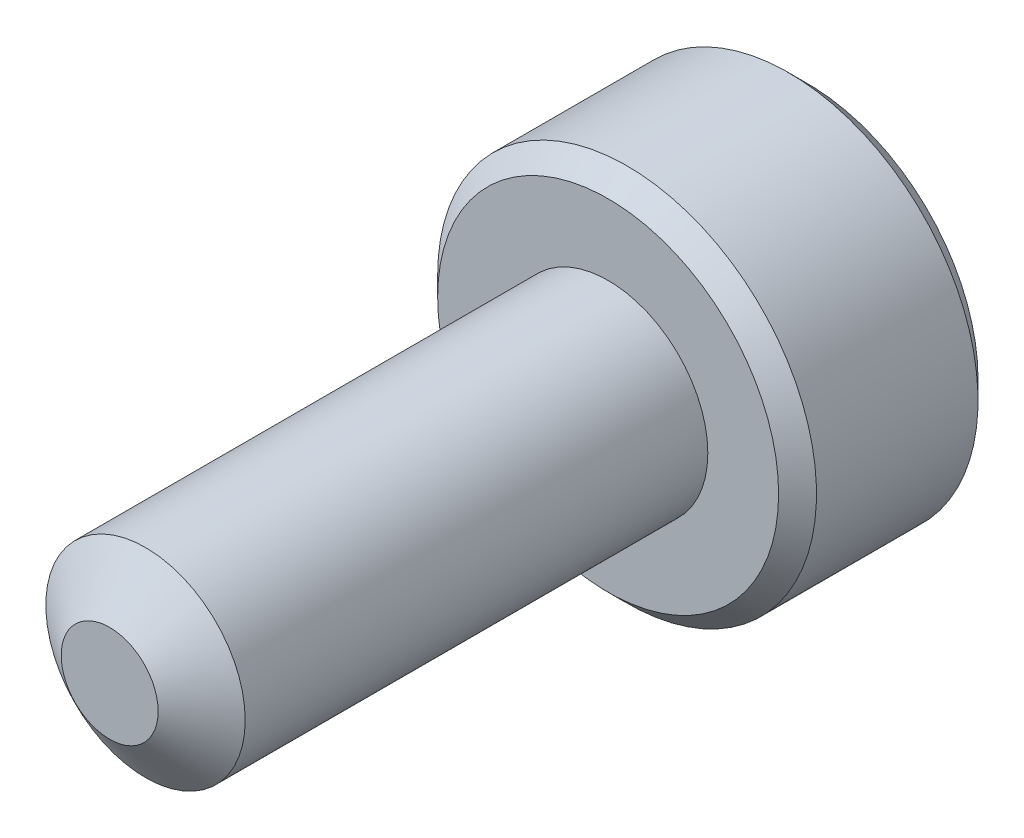
ISO-10303-21;
HEADER;
FILE_DESCRIPTION(('STEP AP214'),'2;1');
FILE_NAME('part.step','',(''),(''),'','','');
FILE_SCHEMA(('AUTOMOTIVE_DESIGN { 1 0 10303 214 1 1 1 1 }'));
ENDSEC;
DATA;
#1=APPLICATION_CONTEXT('core data for automotive mechanical design processes');
#2=APPLICATION_PROTOCOL_DEFINITION('international standard','automotive_design',2000,#1);
#3=PRODUCT_CONTEXT('',#1,'mechanical');
#4=PRODUCT('Part','Part','',(#3));
#5=PRODUCT_RELATED_PRODUCT_CATEGORY('part','',(#4));
#6=PRODUCT_DEFINITION_FORMATION('','',#4);
#7=PRODUCT_DEFINITION_CONTEXT('part definition',#1,'design');
#8=PRODUCT_DEFINITION('design','',#6,#7);
#9=PRODUCT_DEFINITION_SHAPE('','',#8);
#10=(LENGTH_UNIT() NAMED_UNIT(*) SI_UNIT(.MILLI.,.METRE.));
#11=(NAMED_UNIT(*) PLANE_ANGLE_UNIT() SI_UNIT($,.RADIAN.));
#12=(NAMED_UNIT(*) SI_UNIT($,.STERADIAN.) SOLID_ANGLE_UNIT());
#13=UNCERTAINTY_MEASURE_WITH_UNIT(LENGTH_MEASURE(1.E-05),#10,'distance_accuracy_value','');
#14=(GEOMETRIC_REPRESENTATION_CONTEXT(3) GLOBAL_UNCERTAINTY_ASSIGNED_CONTEXT((#13)) GLOBAL_UNIT_ASSIGNED_CONTEXT((#10,
#11,#12)) REPRESENTATION_CONTEXT('',''));
#15=CARTESIAN_POINT('',(0.,0.,0.));
#16=DIRECTION('',(0.,0.,1.));
#17=DIRECTION('',(1.,0.,0.));
#18=AXIS2_PLACEMENT_3D('',#15,#16,#17);
#19=CARTESIAN_POINT('',(0.,0.,-5.));
#20=DIRECTION('',(0.,0.,1.));
#21=DIRECTION('',(1.,0.,0.));
#22=AXIS2_PLACEMENT_3D('',#19,#20,#21);
#23=CYLINDRICAL_SURFACE('',#22,1.);
#24=CARTESIAN_POINT('',(0.,0.,-5.));
#25=DIRECTION('',(0.,0.,-1.));
#26=DIRECTION('',(-1.,0.,0.));
#27=AXIS2_PLACEMENT_3D('',#24,#25,#26);
#28=CIRCLE('',#27,1.);
#29=CARTESIAN_POINT('',(-1.,0.,-5.));
#30=VERTEX_POINT('',#29);
#31=EDGE_CURVE('E231',#30,#30,#28,.F.);
#32=ORIENTED_EDGE('',*,*,#31,.T.);
#33=EDGE_LOOP('',(#32));
#34=FACE_BOUND('',#33,.T.);
#35=CARTESIAN_POINT('',(0.,0.,-0.359771969508557));
#36=DIRECTION('',(0.,0.,1.));
#37=DIRECTION('',(1.,0.,0.));
#38=AXIS2_PLACEMENT_3D('',#35,#36,#37);
#39=CIRCLE('',#38,1.);
#40=CARTESIAN_POINT('',(1.,0.,-0.359771969508557));
#41=VERTEX_POINT('',#40);
#42=EDGE_CURVE('E116',#41,#41,#39,.T.);
#43=ORIENTED_EDGE('',*,*,#42,.F.);
#44=EDGE_LOOP('',(#43));
#45=FACE_BOUND('',#44,.T.);
#46=ADVANCED_FACE('F39',(#34,#45),#23,.T.);
#47=CARTESIAN_POINT('',(0.,0.,0.));
#48=DIRECTION('',(0.,0.,-1.));
#49=DIRECTION('',(-1.,0.,0.));
#50=AXIS2_PLACEMENT_3D('',#47,#48,#49);
#51=CONICAL_SURFACE('',#50,0.486192378864667,0.959931088596884);
#52=ORIENTED_EDGE('',*,*,#42,.T.);
#53=EDGE_LOOP('',(#52));
#54=FACE_BOUND('',#53,.T.);
#55=CARTESIAN_POINT('',(0.,0.,0.));
#56=DIRECTION('',(0.,0.,1.));
#57=DIRECTION('',(1.,0.,0.));
#58=AXIS2_PLACEMENT_3D('',#55,#56,#57);
#59=CIRCLE('',#58,0.486192378864667);
#60=CARTESIAN_POINT('',(0.486192378864667,0.,0.));
#61=VERTEX_POINT('',#60);
#62=EDGE_CURVE('E228',#61,#61,#59,.T.);
#63=ORIENTED_EDGE('',*,*,#62,.F.);
#64=EDGE_LOOP('',(#63));
#65=FACE_BOUND('',#64,.T.);
#66=ADVANCED_FACE('F211',(#54,#65),#51,.T.);
#67=CARTESIAN_POINT('',(0.,0.,0.));
#68=DIRECTION('',(0.,0.,1.));
#69=DIRECTION('',(1.,0.,0.));
#70=AXIS2_PLACEMENT_3D('',#67,#68,#69);
#71=PLANE('',#70);
#72=ORIENTED_EDGE('',*,*,#62,.T.);
#73=EDGE_LOOP('',(#72));
#74=FACE_BOUND('',#73,.T.);
#75=ADVANCED_FACE('F208',(#74),#71,.T.);
#76=CARTESIAN_POINT('',(0.,0.,-7.));
#77=DIRECTION('',(0.,0.,1.));
#78=DIRECTION('',(1.,0.,0.));
#79=AXIS2_PLACEMENT_3D('',#76,#77,#78);
#80=CYLINDRICAL_SURFACE('',#79,1.9);
#81=CARTESIAN_POINT('',(0.,0.,-6.81));
#82=DIRECTION('',(0.,0.,-1.));
#83=DIRECTION('',(-1.,0.,0.));
#84=AXIS2_PLACEMENT_3D('',#81,#82,#83);
#85=CIRCLE('',#84,1.9);
#86=CARTESIAN_POINT('',(-1.9,0.,-6.81));
#87=VERTEX_POINT('',#86);
#88=EDGE_CURVE('E48',#87,#87,#85,.F.);
#89=ORIENTED_EDGE('',*,*,#88,.T.);
#90=EDGE_LOOP('',(#89));
#91=FACE_BOUND('',#90,.T.);
#92=CARTESIAN_POINT('',(0.,0.,-5.19));
#93=DIRECTION('',(0.,0.,-1.));
#94=DIRECTION('',(-1.,0.,0.));
#95=AXIS2_PLACEMENT_3D('',#92,#93,#94);
#96=CIRCLE('',#95,1.9);
#97=CARTESIAN_POINT('',(-1.9,0.,-5.19));
#98=VERTEX_POINT('',#97);
#99=EDGE_CURVE('E185',#98,#98,#96,.T.);
#100=ORIENTED_EDGE('',*,*,#99,.T.);
#101=EDGE_LOOP('',(#100));
#102=FACE_BOUND('',#101,.T.);
#103=ADVANCED_FACE('F192',(#91,#102),#80,.T.);
#104=CARTESIAN_POINT('',(0.,0.,-7.));
#105=DIRECTION('',(0.,0.,-1.));
#106=DIRECTION('',(-1.,0.,0.));
#107=AXIS2_PLACEMENT_3D('',#104,#105,#106);
#108=PLANE('',#107);
#109=CARTESIAN_POINT('',(0.,0.,-7.));
#110=DIRECTION('',(0.,0.,-1.));
#111=DIRECTION('',(-1.,0.,0.));
#112=AXIS2_PLACEMENT_3D('',#109,#110,#111);
#113=CIRCLE('',#112,1.71);
#114=CARTESIAN_POINT('',(-1.71,0.,-7.));
#115=VERTEX_POINT('',#114);
#116=EDGE_CURVE('E115',#115,#115,#113,.T.);
#117=ORIENTED_EDGE('',*,*,#116,.T.);
#118=EDGE_LOOP('',(#117));
#119=FACE_BOUND('',#118,.T.);
#120=CARTESIAN_POINT('',(0.,0.,-7.));
#121=DIRECTION('',(0.,0.,-1.));
#122=DIRECTION('',(-1.,0.,0.));
#123=AXIS2_PLACEMENT_3D('',#120,#121,#122);
#124=CIRCLE('',#123,0.866025403784438);
#125=CARTESIAN_POINT('',(-0.749999999999999,0.43301270189222,-7.));
#126=VERTEX_POINT('',#125);
#127=CARTESIAN_POINT('',(0.,0.866025403784438,-7.));
#128=VERTEX_POINT('',#127);
#129=EDGE_CURVE('E94',#126,#128,#124,.T.);
#130=ORIENTED_EDGE('',*,*,#129,.F.);
#131=CARTESIAN_POINT('',(-0.749999999999999,-0.43301270189222,-7.));
#132=VERTEX_POINT('',#131);
#133=EDGE_CURVE('E54',#132,#126,#124,.T.);
#134=ORIENTED_EDGE('',*,*,#133,.F.);
#135=CARTESIAN_POINT('',(0.,-0.866025403784438,-7.));
#136=VERTEX_POINT('',#135);
#137=EDGE_CURVE('E304',#136,#132,#124,.T.);
#138=ORIENTED_EDGE('',*,*,#137,.F.);
#139=CARTESIAN_POINT('',(0.75,-0.433012701892219,-7.));
#140=VERTEX_POINT('',#139);
#141=EDGE_CURVE('E61',#140,#136,#124,.T.);
#142=ORIENTED_EDGE('',*,*,#141,.F.);
#143=CARTESIAN_POINT('',(0.749999999999999,0.43301270189222,-7.));
#144=VERTEX_POINT('',#143);
#145=EDGE_CURVE('E139',#144,#140,#124,.T.);
#146=ORIENTED_EDGE('',*,*,#145,.F.);
#147=EDGE_CURVE('E104',#128,#144,#124,.T.);
#148=ORIENTED_EDGE('',*,*,#147,.F.);
#149=EDGE_LOOP('',(#130,#134,#138,#142,#146,#148));
#150=FACE_BOUND('',#149,.T.);
#151=ADVANCED_FACE('F138',(#119,#150),#108,.T.);
#152=CARTESIAN_POINT('',(0.,0.,-5.));
#153=DIRECTION('',(0.,0.,-1.));
#154=DIRECTION('',(-1.,0.,0.));
#155=AXIS2_PLACEMENT_3D('',#152,#153,#154);
#156=PLANE('',#155);
#157=CARTESIAN_POINT('',(0.,0.,-5.));
#158=DIRECTION('',(0.,0.,-1.));
#159=DIRECTION('',(-1.,0.,0.));
#160=AXIS2_PLACEMENT_3D('',#157,#158,#159);
#161=CIRCLE('',#160,1.71);
#162=CARTESIAN_POINT('',(-1.71,0.,-5.));
#163=VERTEX_POINT('',#162);
#164=EDGE_CURVE('E11',#163,#163,#161,.F.);
#165=ORIENTED_EDGE('',*,*,#164,.T.);
#166=EDGE_LOOP('',(#165));
#167=FACE_BOUND('',#166,.T.);
#168=ORIENTED_EDGE('',*,*,#31,.F.);
#169=EDGE_LOOP('',(#168));
#170=FACE_BOUND('',#169,.T.);
#171=ADVANCED_FACE('F201',(#167,#170),#156,.F.);
#172=CARTESIAN_POINT('',(0.,0.,-7.));
#173=DIRECTION('',(0.,0.,-1.));
#174=DIRECTION('',(-1.,0.,0.));
#175=AXIS2_PLACEMENT_3D('',#172,#173,#174);
#176=CONICAL_SURFACE('',#175,0.866025403784438,0.78539816339745);
#177=ORIENTED_EDGE('',*,*,#147,.T.);
#178=CARTESIAN_POINT('',(-0.000199999999999593,0.866140873838276,-7.00011549314477));
#179=CARTESIAN_POINT('',(0.0255899625576819,0.851251032013209,-6.98523411046392));
#180=CARTESIAN_POINT('',(0.0518112021286595,0.836112192288419,-6.97122626560696));
#181=CARTESIAN_POINT('',(0.105279708235706,0.805242135894348,-6.94557752468226));
#182=CARTESIAN_POINT('',(0.132532067460573,0.789507978959819,-6.93395091170567));
#183=CARTESIAN_POINT('',(0.187485350381353,0.757780686272653,-6.91403404577224));
#184=CARTESIAN_POINT('',(0.21517225669551,0.741795643459147,-6.90569369408137));
#185=CARTESIAN_POINT('',(0.271155595130853,0.709473647943367,-6.89284274196143));
#186=CARTESIAN_POINT('',(0.299450314843645,0.693137683900542,-6.88832254058884));
#187=CARTESIAN_POINT('',(0.348210289268843,0.664986099540474,-6.88424583309744));
#188=CARTESIAN_POINT('',(0.368612065655573,0.65320712845165,-6.88364279661408));
#189=CARTESIAN_POINT('',(0.40937613469636,0.629671982217687,-6.88465450601553));
#190=CARTESIAN_POINT('',(0.429738417651455,0.617915812672247,-6.88626974099003));
#191=CARTESIAN_POINT('',(0.490534543086824,0.582815153286451,-6.89433614697304));
#192=CARTESIAN_POINT('',(0.530665854996099,0.559645329552698,-6.90400893582772));
#193=CARTESIAN_POINT('',(0.601110400354026,0.518974152327358,-6.92735631797231));
#194=CARTESIAN_POINT('',(0.631753572009087,0.501282308923485,-6.93980855807225));
#195=CARTESIAN_POINT('',(0.69183934580479,0.466591771248069,-6.96785961023086));
#196=CARTESIAN_POINT('',(0.72128548838159,0.449591032904757,-6.98344818590375));
#197=CARTESIAN_POINT('',(0.7502,0.432897231838382,-7.00011549314477));
#198=B_SPLINE_CURVE_WITH_KNOTS('',3,(#178,#179,#180,#181,#182,#183,#184,#185,#186,#187,#188,
#189,#190,#191,#192,#193,#194,#195,#196,#197),.UNSPECIFIED.,.F.,.F.,(4,2,2,2,2,2,2,2,2,4),(0.,
0.0999419466095594,0.200466857654446,0.299393763705717,0.39807129730023,0.468665775681748,
0.539275821398839,0.680536257244566,0.792918418368073,0.904939568716031),.UNSPECIFIED.);
#199=EDGE_CURVE('E109',#128,#144,#198,.T.);
#200=ORIENTED_EDGE('',*,*,#199,.F.);
#201=EDGE_LOOP('',(#177,#200));
#202=FACE_BOUND('',#201,.T.);
#203=ADVANCED_FACE('F110',(#202),#176,.F.);
#204=ORIENTED_EDGE('',*,*,#145,.T.);
#205=CARTESIAN_POINT('',(0.75,-0.863604064974112,-7.27778925823026));
#206=CARTESIAN_POINT('',(0.75,-0.842575879856457,-7.26191493209962));
#207=CARTESIAN_POINT('',(0.75,-0.821430496410148,-7.24619626527057));
#208=CARTESIAN_POINT('',(0.75,-0.778857857530498,-7.21513452070692));
#209=CARTESIAN_POINT('',(0.75,-0.757430533150143,-7.19979153757022));
#210=CARTESIAN_POINT('',(0.75,-0.692340710809909,-7.15420358035938));
#211=CARTESIAN_POINT('',(0.75,-0.648190081142952,-7.12464409180187));
#212=CARTESIAN_POINT('',(0.75,-0.555607181575073,-7.06661558273629));
#213=CARTESIAN_POINT('',(0.75,-0.507074363082497,-7.03830510940166));
#214=CARTESIAN_POINT('',(0.75,-0.407587529818441,-6.98651811179061));
#215=CARTESIAN_POINT('',(0.75,-0.356642419585007,-6.96302529154705));
#216=CARTESIAN_POINT('',(0.75,-0.280165468850109,-6.93428689951103));
#217=CARTESIAN_POINT('',(0.75,-0.255770023962925,-6.9260392748236));
#218=CARTESIAN_POINT('',(0.75,-0.20640327792361,-6.91149717543051));
#219=CARTESIAN_POINT('',(0.75,-0.181431937227494,-6.90520283527902));
#220=CARTESIAN_POINT('',(0.75,-0.106699879455628,-6.88999317388815));
#221=CARTESIAN_POINT('',(0.75,-0.0561907172329769,-6.88437718471751));
#222=CARTESIAN_POINT('',(0.75,0.0430767231074198,-6.88362825645083));
#223=CARTESIAN_POINT('',(0.75,0.0918322433444382,-6.88812345139702));
#224=CARTESIAN_POINT('',(0.75,0.164112195619626,-6.90133730742922));
#225=CARTESIAN_POINT('',(0.75,0.188278676798618,-6.90690144636243));
#226=CARTESIAN_POINT('',(0.75,0.236094480035414,-6.91992316612325));
#227=CARTESIAN_POINT('',(0.75,0.259743845186176,-6.92738058851924));
#228=CARTESIAN_POINT('',(0.75,0.334198278358037,-6.95366646942379));
#229=CARTESIAN_POINT('',(0.75,0.383940060323694,-6.97549033799338));
#230=CARTESIAN_POINT('',(0.75,0.481089224924055,-7.02401180401857));
#231=CARTESIAN_POINT('',(0.75,0.528487417805623,-7.05072691121415));
#232=CARTESIAN_POINT('',(0.75,0.619071540271278,-7.10584285102742));
#233=CARTESIAN_POINT('',(0.75,0.662349745094376,-7.13409394531598));
#234=CARTESIAN_POINT('',(0.75,0.726111622992781,-7.1777671469421));
#235=CARTESIAN_POINT('',(0.75,0.747090419026061,-7.19247886035494));
#236=CARTESIAN_POINT('',(0.75,0.788761341261127,-7.22229138392795));
#237=CARTESIAN_POINT('',(0.75,0.809453544289149,-7.23739208658224));
#238=CARTESIAN_POINT('',(0.75,0.83002638984527,-7.2526540891176));
#239=B_SPLINE_CURVE_WITH_KNOTS('',3,(#205,#206,#207,#208,#209,#210,#211,#212,#213,#214,#215,
#216,#217,#218,#219,#220,#221,#222,#223,#224,#225,#226,#227,#228,#229,#230,#231,#232,#233,#234,
#235,#236,#237,#238),.UNSPECIFIED.,.F.,.F.,(4,2,2,2,2,2,2,2,2,2,2,2,2,2,2,2,4),(0.,
0.0790398443275128,0.158099390527687,0.317425208734855,0.485845155776513,0.65368565843315,
0.730869805756541,0.808059268815783,0.959469653475935,1.1054029045548,1.1797320311882,
1.25405493994416,1.41653726506484,1.57961304282019,1.73458511685198,1.81145152919336,
1.88829692100168),.UNSPECIFIED.);
#240=EDGE_CURVE('E103',#144,#140,#239,.F.);
#241=ORIENTED_EDGE('',*,*,#240,.F.);
#242=EDGE_LOOP('',(#204,#241));
#243=FACE_BOUND('',#242,.T.);
#244=ADVANCED_FACE('F315',(#243),#176,.F.);
#245=ORIENTED_EDGE('',*,*,#141,.T.);
#246=CARTESIAN_POINT('',(0.7502,-0.432897231838382,-7.00011549314477));
#247=CARTESIAN_POINT('',(0.724410037442318,-0.447787073663449,-6.98523411046393));
#248=CARTESIAN_POINT('',(0.698188797871341,-0.462925913388239,-6.97122626560696));
#249=CARTESIAN_POINT('',(0.644720291764294,-0.49379596978231,-6.94557752468226));
#250=CARTESIAN_POINT('',(0.617467932539427,-0.509530126716839,-6.93395091170567));
#251=CARTESIAN_POINT('',(0.562514649618647,-0.541257419404005,-6.91403404577224));
#252=CARTESIAN_POINT('',(0.534827743304491,-0.557242462217511,-6.90569369408137));
#253=CARTESIAN_POINT('',(0.478844404869147,-0.58956445773329,-6.89284274196143));
#254=CARTESIAN_POINT('',(0.450549685156355,-0.605900421776116,-6.88832254058884));
#255=CARTESIAN_POINT('',(0.401789710731157,-0.634052006136183,-6.88424583309744));
#256=CARTESIAN_POINT('',(0.381387934344428,-0.645830977225008,-6.88364279661408));
#257=CARTESIAN_POINT('',(0.34062386530364,-0.669366123458971,-6.88465450601553));
#258=CARTESIAN_POINT('',(0.320261582348545,-0.681122293004411,-6.88626974099003));
#259=CARTESIAN_POINT('',(0.259465456913177,-0.716222952390207,-6.89433614697304));
#260=CARTESIAN_POINT('',(0.219334145003901,-0.73939277612396,-6.90400893582772));
#261=CARTESIAN_POINT('',(0.148889599645975,-0.7800639533493,-6.92735631797231));
#262=CARTESIAN_POINT('',(0.118246427990914,-0.797755796753173,-6.93980855807225));
#263=CARTESIAN_POINT('',(0.0581606541952106,-0.832446334428589,-6.96785961023086));
#264=CARTESIAN_POINT('',(0.0287145116184094,-0.849447072771901,-6.98344818590375));
#265=CARTESIAN_POINT('',(-0.000199999999999876,-0.866140873838277,-7.00011549314477));
#266=B_SPLINE_CURVE_WITH_KNOTS('',3,(#246,#247,#248,#249,#250,#251,#252,#253,#254,#255,#256,
#257,#258,#259,#260,#261,#262,#263,#264,#265),.UNSPECIFIED.,.F.,.F.,(4,2,2,2,2,2,2,2,2,4),(0.,
0.0999419466095594,0.200466857654446,0.299393763705717,0.39807129730023,0.468665775681747,
0.539275821398839,0.680536257244566,0.792918418368073,0.904939568716032),.UNSPECIFIED.);
#267=EDGE_CURVE('E152',#140,#136,#266,.T.);
#268=ORIENTED_EDGE('',*,*,#267,.F.);
#269=EDGE_LOOP('',(#245,#268));
#270=FACE_BOUND('',#269,.T.);
#271=ADVANCED_FACE('F312',(#270),#176,.F.);
#272=ORIENTED_EDGE('',*,*,#137,.T.);
#273=CARTESIAN_POINT('',(0.000200000000000017,-0.866140873838277,-7.00011549314477));
#274=CARTESIAN_POINT('',(-0.0255899625576814,-0.851251032013209,-6.98523411046393));
#275=CARTESIAN_POINT('',(-0.051811202128659,-0.836112192288419,-6.97122626560696));
#276=CARTESIAN_POINT('',(-0.105279708235706,-0.805242135894349,-6.94557752468226));
#277=CARTESIAN_POINT('',(-0.132532067460573,-0.78950797895982,-6.93395091170567));
#278=CARTESIAN_POINT('',(-0.187485350381353,-0.757780686272653,-6.91403404577224));
#279=CARTESIAN_POINT('',(-0.215172256695509,-0.741795643459147,-6.90569369408137));
#280=CARTESIAN_POINT('',(-0.271155595130853,-0.709473647943368,-6.89284274196143));
#281=CARTESIAN_POINT('',(-0.299450314843645,-0.693137683900542,-6.88832254058884));
#282=CARTESIAN_POINT('',(-0.348210289268843,-0.664986099540475,-6.88424583309744));
#283=CARTESIAN_POINT('',(-0.368612065655572,-0.65320712845165,-6.88364279661408));
#284=CARTESIAN_POINT('',(-0.40937613469636,-0.629671982217687,-6.88465450601553));
#285=CARTESIAN_POINT('',(-0.429738417651455,-0.617915812672248,-6.88626974099004));
#286=CARTESIAN_POINT('',(-0.490534543086823,-0.582815153286451,-6.89433614697304));
#287=CARTESIAN_POINT('',(-0.530665854996099,-0.559645329552698,-6.90400893582772));
#288=CARTESIAN_POINT('',(-0.601110400354025,-0.518974152327359,-6.92735631797231));
#289=CARTESIAN_POINT('',(-0.631753572009086,-0.501282308923486,-6.93980855807225));
#290=CARTESIAN_POINT('',(-0.691839345804789,-0.466591771248069,-6.96785961023086));
#291=CARTESIAN_POINT('',(-0.72128548838159,-0.449591032904757,-6.98344818590375));
#292=CARTESIAN_POINT('',(-0.7502,-0.432897231838382,-7.00011549314477));
#293=B_SPLINE_CURVE_WITH_KNOTS('',3,(#273,#274,#275,#276,#277,#278,#279,#280,#281,#282,#283,
#284,#285,#286,#287,#288,#289,#290,#291,#292),.UNSPECIFIED.,.F.,.F.,(4,2,2,2,2,2,2,2,2,4),(0.,
0.0999419466095594,0.200466857654446,0.299393763705717,0.39807129730023,0.468665775681747,
0.539275821398839,0.680536257244566,0.792918418368073,0.904939568716031),.UNSPECIFIED.);
#294=EDGE_CURVE('E281',#136,#132,#293,.T.);
#295=ORIENTED_EDGE('',*,*,#294,.F.);
#296=EDGE_LOOP('',(#272,#295));
#297=FACE_BOUND('',#296,.T.);
#298=ADVANCED_FACE('F309',(#297),#176,.F.);
#299=ORIENTED_EDGE('',*,*,#133,.T.);
#300=CARTESIAN_POINT('',(-0.749999999999999,-0.863604064974112,-7.27778925823026));
#301=CARTESIAN_POINT('',(-0.749999999999999,-0.842575879856458,-7.26191493209962));
#302=CARTESIAN_POINT('',(-0.749999999999999,-0.821430496410149,-7.24619626527057));
#303=CARTESIAN_POINT('',(-0.749999999999999,-0.778857857530499,-7.21513452070692));
#304=CARTESIAN_POINT('',(-0.749999999999999,-0.757430533150143,-7.19979153757022));
#305=CARTESIAN_POINT('',(-0.749999999999999,-0.69234071080991,-7.15420358035938));
#306=CARTESIAN_POINT('',(-0.749999999999999,-0.648190081142953,-7.12464409180187));
#307=CARTESIAN_POINT('',(-0.749999999999999,-0.555607181575074,-7.06661558273629));
#308=CARTESIAN_POINT('',(-0.749999999999999,-0.507074363082498,-7.03830510940166));
#309=CARTESIAN_POINT('',(-0.749999999999999,-0.407587529818442,-6.98651811179061));
#310=CARTESIAN_POINT('',(-0.749999999999999,-0.356642419585008,-6.96302529154705));
#311=CARTESIAN_POINT('',(-0.749999999999999,-0.28016546885011,-6.93428689951103));
#312=CARTESIAN_POINT('',(-0.749999999999999,-0.255770023962927,-6.9260392748236));
#313=CARTESIAN_POINT('',(-0.749999999999999,-0.206403277923611,-6.91149717543051));
#314=CARTESIAN_POINT('',(-0.749999999999999,-0.181431937227495,-6.90520283527902));
#315=CARTESIAN_POINT('',(-0.749999999999999,-0.106699879455629,-6.88999317388815));
#316=CARTESIAN_POINT('',(-0.749999999999999,-0.0561907172329779,-6.88437718471751));
#317=CARTESIAN_POINT('',(-0.749999999999999,0.0430767231074189,-6.88362825645083));
#318=CARTESIAN_POINT('',(-0.749999999999999,0.0918322433444372,-6.88812345139702));
#319=CARTESIAN_POINT('',(-0.749999999999999,0.164112195619625,-6.90133730742922));
#320=CARTESIAN_POINT('',(-0.749999999999999,0.188278676798617,-6.90690144636243));
#321=CARTESIAN_POINT('',(-0.749999999999999,0.236094480035413,-6.91992316612325));
#322=CARTESIAN_POINT('',(-0.749999999999999,0.259743845186176,-6.92738058851924));
#323=CARTESIAN_POINT('',(-0.749999999999999,0.334198278358037,-6.95366646942379));
#324=CARTESIAN_POINT('',(-0.749999999999999,0.383940060323693,-6.97549033799337));
#325=CARTESIAN_POINT('',(-0.749999999999999,0.481089224924055,-7.02401180401857));
#326=CARTESIAN_POINT('',(-0.749999999999999,0.528487417805622,-7.05072691121415));
#327=CARTESIAN_POINT('',(-0.749999999999999,0.619071540271278,-7.10584285102742));
#328=CARTESIAN_POINT('',(-0.749999999999999,0.662349745094376,-7.13409394531598));
#329=CARTESIAN_POINT('',(-0.749999999999999,0.726111622992782,-7.1777671469421));
#330=CARTESIAN_POINT('',(-0.749999999999999,0.747090419026061,-7.19247886035494));
#331=CARTESIAN_POINT('',(-0.749999999999999,0.788761341261127,-7.22229138392795));
#332=CARTESIAN_POINT('',(-0.749999999999999,0.809453544289149,-7.23739208658224));
#333=CARTESIAN_POINT('',(-0.749999999999999,0.83002638984527,-7.2526540891176));
#334=B_SPLINE_CURVE_WITH_KNOTS('',3,(#300,#301,#302,#303,#304,#305,#306,#307,#308,#309,#310,
#311,#312,#313,#314,#315,#316,#317,#318,#319,#320,#321,#322,#323,#324,#325,#326,#327,#328,#329,
#330,#331,#332,#333),.UNSPECIFIED.,.F.,.F.,(4,2,2,2,2,2,2,2,2,2,2,2,2,2,2,2,4),(0.,
0.0790398443275128,0.158099390527687,0.317425208734855,0.485845155776513,0.653685658433149,
0.730869805756541,0.808059268815782,0.959469653475935,1.1054029045548,1.1797320311882,
1.25405493994416,1.41653726506484,1.57961304282019,1.73458511685198,1.81145152919337,
1.88829692100168),.UNSPECIFIED.);
#335=EDGE_CURVE('E127',#132,#126,#334,.T.);
#336=ORIENTED_EDGE('',*,*,#335,.F.);
#337=EDGE_LOOP('',(#299,#336));
#338=FACE_BOUND('',#337,.T.);
#339=ADVANCED_FACE('F324',(#338),#176,.F.);
#340=ORIENTED_EDGE('',*,*,#129,.T.);
#341=CARTESIAN_POINT('',(-0.750199999999999,0.432897231838381,-7.00011549314477));
#342=CARTESIAN_POINT('',(-0.724410037442318,0.447787073663449,-6.98523411046392));
#343=CARTESIAN_POINT('',(-0.69818879787134,0.462925913388239,-6.97122626560696));
#344=CARTESIAN_POINT('',(-0.644720291764293,0.49379596978231,-6.94557752468226));
#345=CARTESIAN_POINT('',(-0.617467932539427,0.509530126716839,-6.93395091170567));
#346=CARTESIAN_POINT('',(-0.562514649618646,0.541257419404005,-6.91403404577224));
#347=CARTESIAN_POINT('',(-0.53482774330449,0.557242462217511,-6.90569369408137));
#348=CARTESIAN_POINT('',(-0.478844404869146,0.589564457733291,-6.89284274196143));
#349=CARTESIAN_POINT('',(-0.450549685156354,0.605900421776116,-6.88832254058884));
#350=CARTESIAN_POINT('',(-0.401789710731156,0.634052006136183,-6.88424583309744));
#351=CARTESIAN_POINT('',(-0.381387934344427,0.645830977225008,-6.88364279661408));
#352=CARTESIAN_POINT('',(-0.340623865303639,0.669366123458971,-6.88465450601553));
#353=CARTESIAN_POINT('',(-0.320261582348544,0.681122293004411,-6.88626974099003));
#354=CARTESIAN_POINT('',(-0.259465456913175,0.716222952390207,-6.89433614697304));
#355=CARTESIAN_POINT('',(-0.2193341450039,0.73939277612396,-6.90400893582772));
#356=CARTESIAN_POINT('',(-0.148889599645973,0.7800639533493,-6.92735631797231));
#357=CARTESIAN_POINT('',(-0.118246427990913,0.797755796753173,-6.93980855807225));
#358=CARTESIAN_POINT('',(-0.0581606541952093,0.832446334428589,-6.96785961023086));
#359=CARTESIAN_POINT('',(-0.0287145116184084,0.849447072771901,-6.98344818590375));
#360=CARTESIAN_POINT('',(0.000200000000000695,0.866140873838276,-7.00011549314477));
#361=B_SPLINE_CURVE_WITH_KNOTS('',3,(#341,#342,#343,#344,#345,#346,#347,#348,#349,#350,#351,
#352,#353,#354,#355,#356,#357,#358,#359,#360),.UNSPECIFIED.,.F.,.F.,(4,2,2,2,2,2,2,2,2,4),(0.,
0.0999419466095595,0.200466857654446,0.299393763705717,0.39807129730023,0.468665775681748,
0.539275821398839,0.680536257244566,0.792918418368074,0.904939568716032),.UNSPECIFIED.);
#362=EDGE_CURVE('E98',#126,#128,#361,.T.);
#363=ORIENTED_EDGE('',*,*,#362,.F.);
#364=EDGE_LOOP('',(#340,#363));
#365=FACE_BOUND('',#364,.T.);
#366=ADVANCED_FACE('F96',(#365),#176,.F.);
#367=CARTESIAN_POINT('',(0.749999999999999,1.29903810567666,-5.875));
#368=DIRECTION('',(0.,0.,-1.));
#369=DIRECTION('',(-1.,0.,0.));
#370=AXIS2_PLACEMENT_3D('',#367,#368,#369);
#371=PLANE('',#370);
#372=DIRECTION('',(0.866025403784439,0.5,0.));
#373=VECTOR('',#372,1.);
#374=CARTESIAN_POINT('',(-0.749999999999999,0.433012701892219,-5.875));
#375=LINE('',#374,#373);
#376=CARTESIAN_POINT('',(-0.749999999999999,0.433012701892219,-5.875));
#377=VERTEX_POINT('',#376);
#378=CARTESIAN_POINT('',(0.,0.866025403784438,-5.875));
#379=VERTEX_POINT('',#378);
#380=EDGE_CURVE('E126',#377,#379,#375,.T.);
#381=ORIENTED_EDGE('',*,*,#380,.T.);
#382=DIRECTION('',(0.866025403784439,-0.5,0.));
#383=VECTOR('',#382,1.);
#384=CARTESIAN_POINT('',(0.,0.866025403784438,-5.875));
#385=LINE('',#384,#383);
#386=CARTESIAN_POINT('',(0.75,0.43301270189222,-5.875));
#387=VERTEX_POINT('',#386);
#388=EDGE_CURVE('E131',#379,#387,#385,.T.);
#389=ORIENTED_EDGE('',*,*,#388,.T.);
#390=DIRECTION('',(0.,-1.,0.));
#391=VECTOR('',#390,1.);
#392=CARTESIAN_POINT('',(0.75,0.43301270189222,-5.875));
#393=LINE('',#392,#391);
#394=CARTESIAN_POINT('',(0.75,-0.43301270189222,-5.875));
#395=VERTEX_POINT('',#394);
#396=EDGE_CURVE('E263',#387,#395,#393,.T.);
#397=ORIENTED_EDGE('',*,*,#396,.T.);
#398=DIRECTION('',(-0.866025403784439,-0.5,0.));
#399=VECTOR('',#398,1.);
#400=CARTESIAN_POINT('',(0.75,-0.43301270189222,-5.875));
#401=LINE('',#400,#399);
#402=CARTESIAN_POINT('',(0.,-0.866025403784439,-5.875));
#403=VERTEX_POINT('',#402);
#404=EDGE_CURVE('E259',#395,#403,#401,.T.);
#405=ORIENTED_EDGE('',*,*,#404,.T.);
#406=DIRECTION('',(-0.866025403784439,0.5,0.));
#407=VECTOR('',#406,1.);
#408=CARTESIAN_POINT('',(0.,-0.866025403784439,-5.875));
#409=LINE('',#408,#407);
#410=CARTESIAN_POINT('',(-0.749999999999999,-0.43301270189222,-5.875));
#411=VERTEX_POINT('',#410);
#412=EDGE_CURVE('E255',#403,#411,#409,.T.);
#413=ORIENTED_EDGE('',*,*,#412,.T.);
#414=DIRECTION('',(0.,1.,0.));
#415=VECTOR('',#414,1.);
#416=CARTESIAN_POINT('',(-0.749999999999999,-0.43301270189222,-5.875));
#417=LINE('',#416,#415);
#418=EDGE_CURVE('E135',#411,#377,#417,.T.);
#419=ORIENTED_EDGE('',*,*,#418,.T.);
#420=EDGE_LOOP('',(#381,#389,#397,#405,#413,#419));
#421=FACE_BOUND('',#420,.T.);
#422=ADVANCED_FACE('F172',(#421),#371,.T.);
#423=CARTESIAN_POINT('',(0.,0.866025403784438,-5.875));
#424=DIRECTION('',(0.5,0.866025403784439,0.));
#425=DIRECTION('',(-0.866025403784439,0.5,0.));
#426=AXIS2_PLACEMENT_3D('',#423,#424,#425);
#427=PLANE('',#426);
#428=DIRECTION('',(0.,0.,-1.));
#429=VECTOR('',#428,1.);
#430=CARTESIAN_POINT('',(0.,0.866025403784438,-5.875));
#431=LINE('',#430,#429);
#432=EDGE_CURVE('E122',#379,#128,#431,.T.);
#433=ORIENTED_EDGE('',*,*,#432,.T.);
#434=ORIENTED_EDGE('',*,*,#199,.T.);
#435=DIRECTION('',(0.,0.,-1.));
#436=VECTOR('',#435,1.);
#437=CARTESIAN_POINT('',(0.75,0.43301270189222,-5.875));
#438=LINE('',#437,#436);
#439=EDGE_CURVE('E134',#387,#144,#438,.T.);
#440=ORIENTED_EDGE('',*,*,#439,.F.);
#441=ORIENTED_EDGE('',*,*,#388,.F.);
#442=EDGE_LOOP('',(#433,#434,#440,#441));
#443=FACE_BOUND('',#442,.T.);
#444=ADVANCED_FACE('F129',(#443),#427,.F.);
#445=CARTESIAN_POINT('',(0.75,0.43301270189222,-5.875));
#446=DIRECTION('',(1.,0.,0.));
#447=DIRECTION('',(0.,1.,0.));
#448=AXIS2_PLACEMENT_3D('',#445,#446,#447);
#449=PLANE('',#448);
#450=ORIENTED_EDGE('',*,*,#439,.T.);
#451=ORIENTED_EDGE('',*,*,#240,.T.);
#452=DIRECTION('',(0.,0.,-1.));
#453=VECTOR('',#452,1.);
#454=CARTESIAN_POINT('',(0.75,-0.43301270189222,-5.875));
#455=LINE('',#454,#453);
#456=EDGE_CURVE('E239',#395,#140,#455,.T.);
#457=ORIENTED_EDGE('',*,*,#456,.F.);
#458=ORIENTED_EDGE('',*,*,#396,.F.);
#459=EDGE_LOOP('',(#450,#451,#457,#458));
#460=FACE_BOUND('',#459,.T.);
#461=ADVANCED_FACE('F161',(#460),#449,.F.);
#462=CARTESIAN_POINT('',(0.75,-0.43301270189222,-5.875));
#463=DIRECTION('',(0.5,-0.866025403784439,0.));
#464=DIRECTION('',(0.866025403784439,0.5,0.));
#465=AXIS2_PLACEMENT_3D('',#462,#463,#464);
#466=PLANE('',#465);
#467=ORIENTED_EDGE('',*,*,#456,.T.);
#468=ORIENTED_EDGE('',*,*,#267,.T.);
#469=DIRECTION('',(0.,0.,-1.));
#470=VECTOR('',#469,1.);
#471=CARTESIAN_POINT('',(0.,-0.866025403784439,-5.875));
#472=LINE('',#471,#470);
#473=EDGE_CURVE('E243',#403,#136,#472,.T.);
#474=ORIENTED_EDGE('',*,*,#473,.F.);
#475=ORIENTED_EDGE('',*,*,#404,.F.);
#476=EDGE_LOOP('',(#467,#468,#474,#475));
#477=FACE_BOUND('',#476,.T.);
#478=ADVANCED_FACE('F165',(#477),#466,.F.);
#479=CARTESIAN_POINT('',(0.,-0.866025403784439,-5.875));
#480=DIRECTION('',(-0.5,-0.866025403784439,0.));
#481=DIRECTION('',(0.866025403784439,-0.5,0.));
#482=AXIS2_PLACEMENT_3D('',#479,#480,#481);
#483=PLANE('',#482);
#484=ORIENTED_EDGE('',*,*,#473,.T.);
#485=ORIENTED_EDGE('',*,*,#294,.T.);
#486=DIRECTION('',(0.,0.,-1.));
#487=VECTOR('',#486,1.);
#488=CARTESIAN_POINT('',(-0.749999999999999,-0.43301270189222,-5.875));
#489=LINE('',#488,#487);
#490=EDGE_CURVE('E247',#411,#132,#489,.T.);
#491=ORIENTED_EDGE('',*,*,#490,.F.);
#492=ORIENTED_EDGE('',*,*,#412,.F.);
#493=EDGE_LOOP('',(#484,#485,#491,#492));
#494=FACE_BOUND('',#493,.T.);
#495=ADVANCED_FACE('F289',(#494),#483,.F.);
#496=CARTESIAN_POINT('',(-0.749999999999999,-0.43301270189222,-5.875));
#497=DIRECTION('',(-1.,0.,0.));
#498=DIRECTION('',(0.,-1.,0.));
#499=AXIS2_PLACEMENT_3D('',#496,#497,#498);
#500=PLANE('',#499);
#501=ORIENTED_EDGE('',*,*,#490,.T.);
#502=ORIENTED_EDGE('',*,*,#335,.T.);
#503=DIRECTION('',(0.,0.,-1.));
#504=VECTOR('',#503,1.);
#505=CARTESIAN_POINT('',(-0.749999999999999,0.433012701892219,-5.875));
#506=LINE('',#505,#504);
#507=EDGE_CURVE('E124',#377,#126,#506,.T.);
#508=ORIENTED_EDGE('',*,*,#507,.F.);
#509=ORIENTED_EDGE('',*,*,#418,.F.);
#510=EDGE_LOOP('',(#501,#502,#508,#509));
#511=FACE_BOUND('',#510,.T.);
#512=ADVANCED_FACE('F286',(#511),#500,.F.);
#513=CARTESIAN_POINT('',(-0.749999999999999,0.433012701892219,-5.875));
#514=DIRECTION('',(-0.5,0.866025403784439,0.));
#515=DIRECTION('',(-0.866025403784439,-0.5,0.));
#516=AXIS2_PLACEMENT_3D('',#513,#514,#515);
#517=PLANE('',#516);
#518=ORIENTED_EDGE('',*,*,#507,.T.);
#519=ORIENTED_EDGE('',*,*,#362,.T.);
#520=ORIENTED_EDGE('',*,*,#432,.F.);
#521=ORIENTED_EDGE('',*,*,#380,.F.);
#522=EDGE_LOOP('',(#518,#519,#520,#521));
#523=FACE_BOUND('',#522,.T.);
#524=ADVANCED_FACE('F120',(#523),#517,.F.);
#525=CARTESIAN_POINT('',(0.,0.,-7.));
#526=DIRECTION('',(0.,0.,1.));
#527=DIRECTION('',(1.,0.,0.));
#528=AXIS2_PLACEMENT_3D('',#525,#526,#527);
#529=CONICAL_SURFACE('',#528,1.71,0.785398163397447);
#530=ORIENTED_EDGE('',*,*,#88,.F.);
#531=EDGE_LOOP('',(#530));
#532=FACE_BOUND('',#531,.T.);
#533=ORIENTED_EDGE('',*,*,#116,.F.);
#534=EDGE_LOOP('',(#533));
#535=FACE_BOUND('',#534,.T.);
#536=ADVANCED_FACE('F195',(#532,#535),#529,.T.);
#537=CARTESIAN_POINT('',(0.,0.,-5.19));
#538=DIRECTION('',(0.,0.,-1.));
#539=DIRECTION('',(-1.,0.,0.));
#540=AXIS2_PLACEMENT_3D('',#537,#538,#539);
#541=CONICAL_SURFACE('',#540,1.9,0.78539816339745);
#542=ORIENTED_EDGE('',*,*,#164,.F.);
#543=EDGE_LOOP('',(#542));
#544=FACE_BOUND('',#543,.T.);
#545=ORIENTED_EDGE('',*,*,#99,.F.);
#546=EDGE_LOOP('',(#545));
#547=FACE_BOUND('',#546,.T.);
#548=ADVANCED_FACE('F41',(#544,#547),#541,.T.);
#549=CLOSED_SHELL('',(#46,#66,#75,#103,#151,#171,#203,#244,#271,#298,#339,#366,#422,#444,#461,
#478,#495,#512,#524,#536,#548));
#550=MANIFOLD_SOLID_BREP('B2',#549);
#551=ADVANCED_BREP_SHAPE_REPRESENTATION('',(#18,#550),#14);
#552=SHAPE_DEFINITION_REPRESENTATION(#9,#551);
ENDSEC;
END-ISO-10303-21;
